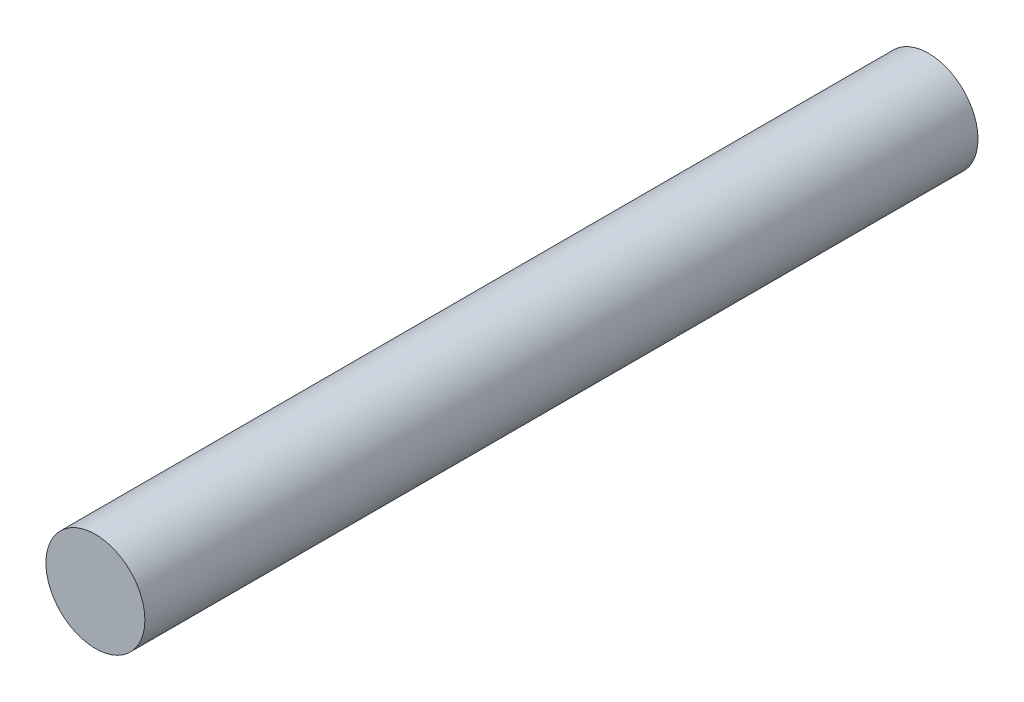
ISO-10303-21;
HEADER;
FILE_DESCRIPTION(('STEP AP214'),'2;1');
FILE_NAME('part.step','',(''),(''),'','','');
FILE_SCHEMA(('AUTOMOTIVE_DESIGN { 1 0 10303 214 1 1 1 1 }'));
ENDSEC;
DATA;
#1=APPLICATION_CONTEXT('core data for automotive mechanical design processes');
#2=APPLICATION_PROTOCOL_DEFINITION('international standard','automotive_design',2000,#1);
#3=PRODUCT_CONTEXT('',#1,'mechanical');
#4=PRODUCT('Part','Part','',(#3));
#5=PRODUCT_RELATED_PRODUCT_CATEGORY('part','',(#4));
#6=PRODUCT_DEFINITION_FORMATION('','',#4);
#7=PRODUCT_DEFINITION_CONTEXT('part definition',#1,'design');
#8=PRODUCT_DEFINITION('design','',#6,#7);
#9=PRODUCT_DEFINITION_SHAPE('','',#8);
#10=(LENGTH_UNIT() NAMED_UNIT(*) SI_UNIT(.MILLI.,.METRE.));
#11=(NAMED_UNIT(*) PLANE_ANGLE_UNIT() SI_UNIT($,.RADIAN.));
#12=(NAMED_UNIT(*) SI_UNIT($,.STERADIAN.) SOLID_ANGLE_UNIT());
#13=UNCERTAINTY_MEASURE_WITH_UNIT(LENGTH_MEASURE(1.E-05),#10,'distance_accuracy_value','');
#14=(GEOMETRIC_REPRESENTATION_CONTEXT(3) GLOBAL_UNCERTAINTY_ASSIGNED_CONTEXT((#13)) GLOBAL_UNIT_ASSIGNED_CONTEXT((#10,
#11,#12)) REPRESENTATION_CONTEXT('',''));
#15=CARTESIAN_POINT('',(0.,0.,0.));
#16=DIRECTION('',(0.,0.,1.));
#17=DIRECTION('',(1.,0.,0.));
#18=AXIS2_PLACEMENT_3D('',#15,#16,#17);
#19=CARTESIAN_POINT('',(0.,0.,43.35));
#20=DIRECTION('',(0.,0.,-1.));
#21=DIRECTION('',(-1.,0.,0.));
#22=AXIS2_PLACEMENT_3D('',#19,#20,#21);
#23=CYLINDRICAL_SURFACE('',#22,2.575);
#24=CARTESIAN_POINT('',(0.,0.,43.35));
#25=DIRECTION('',(0.,0.,1.));
#26=DIRECTION('',(1.,0.,0.));
#27=AXIS2_PLACEMENT_3D('',#24,#25,#26);
#28=CIRCLE('',#27,2.575);
#29=CARTESIAN_POINT('',(2.575,0.,43.35));
#30=VERTEX_POINT('',#29);
#31=EDGE_CURVE('E10',#30,#30,#28,.T.);
#32=ORIENTED_EDGE('',*,*,#31,.F.);
#33=EDGE_LOOP('',(#32));
#34=FACE_BOUND('',#33,.T.);
#35=CARTESIAN_POINT('',(0.,0.,0.));
#36=DIRECTION('',(0.,0.,1.));
#37=DIRECTION('',(1.,0.,0.));
#38=AXIS2_PLACEMENT_3D('',#35,#36,#37);
#39=CIRCLE('',#38,2.575);
#40=CARTESIAN_POINT('',(2.575,0.,0.));
#41=VERTEX_POINT('',#40);
#42=EDGE_CURVE('E40',#41,#41,#39,.T.);
#43=ORIENTED_EDGE('',*,*,#42,.T.);
#44=EDGE_LOOP('',(#43));
#45=FACE_BOUND('',#44,.T.);
#46=ADVANCED_FACE('F37',(#34,#45),#23,.T.);
#47=CARTESIAN_POINT('',(0.,0.,43.35));
#48=DIRECTION('',(0.,0.,1.));
#49=DIRECTION('',(1.,0.,0.));
#50=AXIS2_PLACEMENT_3D('',#47,#48,#49);
#51=PLANE('',#50);
#52=ORIENTED_EDGE('',*,*,#31,.T.);
#53=EDGE_LOOP('',(#52));
#54=FACE_BOUND('',#53,.T.);
#55=ADVANCED_FACE('F54',(#54),#51,.T.);
#56=CARTESIAN_POINT('',(0.,0.,0.));
#57=DIRECTION('',(0.,0.,1.));
#58=DIRECTION('',(1.,0.,0.));
#59=AXIS2_PLACEMENT_3D('',#56,#57,#58);
#60=PLANE('',#59);
#61=ORIENTED_EDGE('',*,*,#42,.F.);
#62=EDGE_LOOP('',(#61));
#63=FACE_BOUND('',#62,.T.);
#64=ADVANCED_FACE('F52',(#63),#60,.F.);
#65=CLOSED_SHELL('',(#46,#55,#64));
#66=MANIFOLD_SOLID_BREP('B2',#65);
#67=ADVANCED_BREP_SHAPE_REPRESENTATION('',(#18,#66),#14);
#68=SHAPE_DEFINITION_REPRESENTATION(#9,#67);
ENDSEC;
END-ISO-10303-21;
